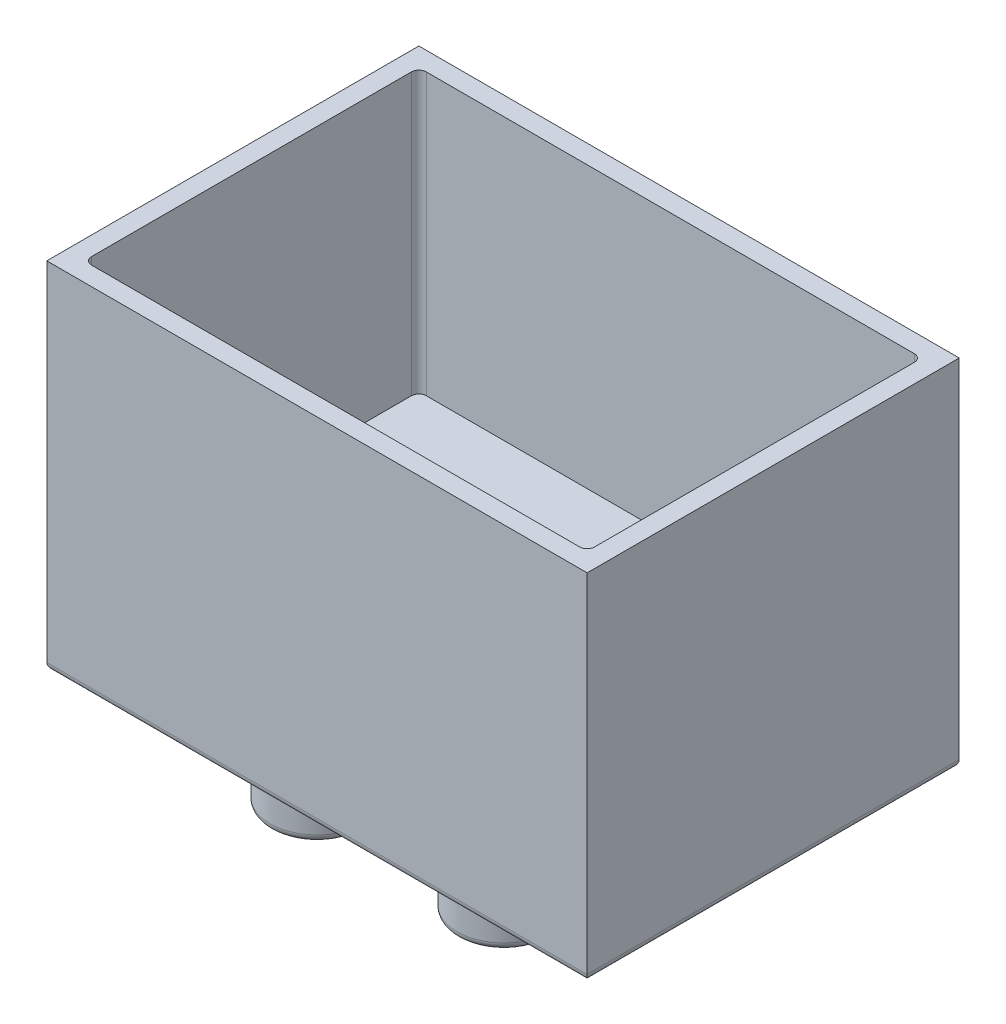
ISO-10303-21;
HEADER;
FILE_DESCRIPTION(('STEP AP214'),'2;1');
FILE_NAME('part.step','',(''),(''),'','','');
FILE_SCHEMA(('AUTOMOTIVE_DESIGN { 1 0 10303 214 1 1 1 1 }'));
ENDSEC;
DATA;
#1=APPLICATION_CONTEXT('core data for automotive mechanical design processes');
#2=APPLICATION_PROTOCOL_DEFINITION('international standard','automotive_design',2000,#1);
#3=PRODUCT_CONTEXT('',#1,'mechanical');
#4=PRODUCT('Part','Part','',(#3));
#5=PRODUCT_RELATED_PRODUCT_CATEGORY('part','',(#4));
#6=PRODUCT_DEFINITION_FORMATION('','',#4);
#7=PRODUCT_DEFINITION_CONTEXT('part definition',#1,'design');
#8=PRODUCT_DEFINITION('design','',#6,#7);
#9=PRODUCT_DEFINITION_SHAPE('','',#8);
#10=(LENGTH_UNIT() NAMED_UNIT(*) SI_UNIT(.MILLI.,.METRE.));
#11=(NAMED_UNIT(*) PLANE_ANGLE_UNIT() SI_UNIT($,.RADIAN.));
#12=(NAMED_UNIT(*) SI_UNIT($,.STERADIAN.) SOLID_ANGLE_UNIT());
#13=UNCERTAINTY_MEASURE_WITH_UNIT(LENGTH_MEASURE(1.E-05),#10,'distance_accuracy_value','');
#14=(GEOMETRIC_REPRESENTATION_CONTEXT(3) GLOBAL_UNCERTAINTY_ASSIGNED_CONTEXT((#13)) GLOBAL_UNIT_ASSIGNED_CONTEXT((#10,
#11,#12)) REPRESENTATION_CONTEXT('',''));
#15=CARTESIAN_POINT('',(0.,0.,0.));
#16=DIRECTION('',(0.,0.,1.));
#17=DIRECTION('',(1.,0.,0.));
#18=AXIS2_PLACEMENT_3D('',#15,#16,#17);
#19=CARTESIAN_POINT('',(0.,15.,0.2));
#20=DIRECTION('',(0.,0.,-1.));
#21=DIRECTION('',(-1.,0.,0.));
#22=AXIS2_PLACEMENT_3D('',#19,#20,#21);
#23=PLANE('',#22);
#24=DIRECTION('',(1.,0.,0.));
#25=VECTOR('',#24,1.);
#26=CARTESIAN_POINT('',(0.,15.,0.2));
#27=LINE('',#26,#25);
#28=CARTESIAN_POINT('',(0.2,15.,0.2));
#29=VERTEX_POINT('',#28);
#30=CARTESIAN_POINT('',(26.3,15.,0.2));
#31=VERTEX_POINT('',#30);
#32=EDGE_CURVE('E180',#29,#31,#27,.T.);
#33=ORIENTED_EDGE('',*,*,#32,.T.);
#34=DIRECTION('',(0.,-1.,0.));
#35=VECTOR('',#34,1.);
#36=CARTESIAN_POINT('',(26.3,0.,0.2));
#37=LINE('',#36,#35);
#38=CARTESIAN_POINT('',(26.3,0.,0.2));
#39=VERTEX_POINT('',#38);
#40=EDGE_CURVE('E255',#31,#39,#37,.T.);
#41=ORIENTED_EDGE('',*,*,#40,.T.);
#42=DIRECTION('',(1.,0.,0.));
#43=VECTOR('',#42,1.);
#44=CARTESIAN_POINT('',(0.,0.,0.2));
#45=LINE('',#44,#43);
#46=CARTESIAN_POINT('',(0.2,0.,0.2));
#47=VERTEX_POINT('',#46);
#48=EDGE_CURVE('E192',#47,#39,#45,.T.);
#49=ORIENTED_EDGE('',*,*,#48,.F.);
#50=DIRECTION('',(0.,-1.,0.));
#51=VECTOR('',#50,1.);
#52=CARTESIAN_POINT('',(0.2,15.,0.2));
#53=LINE('',#52,#51);
#54=EDGE_CURVE('E244',#47,#29,#53,.F.);
#55=ORIENTED_EDGE('',*,*,#54,.T.);
#56=EDGE_LOOP('',(#33,#41,#49,#55));
#57=FACE_BOUND('',#56,.T.);
#58=ADVANCED_FACE('F45',(#57),#23,.T.);
#59=CARTESIAN_POINT('',(-0.2,15.,0.));
#60=DIRECTION('',(-1.,0.,0.));
#61=DIRECTION('',(0.,0.,1.));
#62=AXIS2_PLACEMENT_3D('',#59,#60,#61);
#63=PLANE('',#62);
#64=DIRECTION('',(0.,0.,-1.));
#65=VECTOR('',#64,1.);
#66=CARTESIAN_POINT('',(-0.2,15.,0.));
#67=LINE('',#66,#65);
#68=CARTESIAN_POINT('',(-0.2,15.,-0.2));
#69=VERTEX_POINT('',#68);
#70=CARTESIAN_POINT('',(-0.2,15.,-17.3));
#71=VERTEX_POINT('',#70);
#72=EDGE_CURVE('E183',#69,#71,#67,.T.);
#73=ORIENTED_EDGE('',*,*,#72,.F.);
#74=DIRECTION('',(0.,-1.,0.));
#75=VECTOR('',#74,1.);
#76=CARTESIAN_POINT('',(-0.2,15.,-0.2));
#77=LINE('',#76,#75);
#78=CARTESIAN_POINT('',(-0.2,0.,-0.2));
#79=VERTEX_POINT('',#78);
#80=EDGE_CURVE('E277',#69,#79,#77,.T.);
#81=ORIENTED_EDGE('',*,*,#80,.T.);
#82=DIRECTION('',(0.,0.,-1.));
#83=VECTOR('',#82,1.);
#84=CARTESIAN_POINT('',(-0.2,0.,0.));
#85=LINE('',#84,#83);
#86=CARTESIAN_POINT('',(-0.2,0.,-17.3));
#87=VERTEX_POINT('',#86);
#88=EDGE_CURVE('E195',#79,#87,#85,.T.);
#89=ORIENTED_EDGE('',*,*,#88,.T.);
#90=DIRECTION('',(0.,-1.,0.));
#91=VECTOR('',#90,1.);
#92=CARTESIAN_POINT('',(-0.2,15.,-17.3));
#93=LINE('',#92,#91);
#94=EDGE_CURVE('E60',#87,#71,#93,.F.);
#95=ORIENTED_EDGE('',*,*,#94,.T.);
#96=EDGE_LOOP('',(#73,#81,#89,#95));
#97=FACE_BOUND('',#96,.T.);
#98=ADVANCED_FACE('F304',(#97),#63,.F.);
#99=CARTESIAN_POINT('',(0.,15.,-17.7));
#100=DIRECTION('',(0.,0.,-1.));
#101=DIRECTION('',(-1.,0.,0.));
#102=AXIS2_PLACEMENT_3D('',#99,#100,#101);
#103=PLANE('',#102);
#104=DIRECTION('',(1.,0.,0.));
#105=VECTOR('',#104,1.);
#106=CARTESIAN_POINT('',(0.,0.,-17.7));
#107=LINE('',#106,#105);
#108=CARTESIAN_POINT('',(0.2,0.,-17.7));
#109=VERTEX_POINT('',#108);
#110=CARTESIAN_POINT('',(26.3,0.,-17.7));
#111=VERTEX_POINT('',#110);
#112=EDGE_CURVE('E175',#109,#111,#107,.T.);
#113=ORIENTED_EDGE('',*,*,#112,.T.);
#114=DIRECTION('',(0.,-1.,0.));
#115=VECTOR('',#114,1.);
#116=CARTESIAN_POINT('',(26.3,15.,-17.7));
#117=LINE('',#116,#115);
#118=CARTESIAN_POINT('',(26.3,15.,-17.7));
#119=VERTEX_POINT('',#118);
#120=EDGE_CURVE('E274',#111,#119,#117,.F.);
#121=ORIENTED_EDGE('',*,*,#120,.T.);
#122=DIRECTION('',(1.,0.,0.));
#123=VECTOR('',#122,1.);
#124=CARTESIAN_POINT('',(0.,15.,-17.7));
#125=LINE('',#124,#123);
#126=CARTESIAN_POINT('',(0.2,15.,-17.7));
#127=VERTEX_POINT('',#126);
#128=EDGE_CURVE('E185',#127,#119,#125,.T.);
#129=ORIENTED_EDGE('',*,*,#128,.F.);
#130=DIRECTION('',(0.,-1.,0.));
#131=VECTOR('',#130,1.);
#132=CARTESIAN_POINT('',(0.2,0.,-17.7));
#133=LINE('',#132,#131);
#134=EDGE_CURVE('E271',#127,#109,#133,.T.);
#135=ORIENTED_EDGE('',*,*,#134,.T.);
#136=EDGE_LOOP('',(#113,#121,#129,#135));
#137=FACE_BOUND('',#136,.T.);
#138=ADVANCED_FACE('F299',(#137),#103,.F.);
#139=CARTESIAN_POINT('',(-1.2,15.,0.));
#140=DIRECTION('',(-1.,0.,0.));
#141=DIRECTION('',(0.,0.,1.));
#142=AXIS2_PLACEMENT_3D('',#139,#140,#141);
#143=PLANE('',#142);
#144=DIRECTION('',(0.,-1.,0.));
#145=VECTOR('',#144,1.);
#146=CARTESIAN_POINT('',(-1.2,15.,-18.7));
#147=LINE('',#146,#145);
#148=CARTESIAN_POINT('',(-1.2,15.,-18.7));
#149=VERTEX_POINT('',#148);
#150=CARTESIAN_POINT('',(-1.2,-3.6,-18.7));
#151=VERTEX_POINT('',#150);
#152=EDGE_CURVE('E191',#149,#151,#147,.T.);
#153=ORIENTED_EDGE('',*,*,#152,.T.);
#154=DIRECTION('',(0.,0.,-1.));
#155=VECTOR('',#154,1.);
#156=CARTESIAN_POINT('',(-1.2,-3.6,1.2));
#157=LINE('',#156,#155);
#158=CARTESIAN_POINT('',(-1.2,-3.6,1.2));
#159=VERTEX_POINT('',#158);
#160=EDGE_CURVE('E154',#151,#159,#157,.F.);
#161=ORIENTED_EDGE('',*,*,#160,.T.);
#162=DIRECTION('',(0.,-1.,0.));
#163=VECTOR('',#162,1.);
#164=CARTESIAN_POINT('',(-1.2,15.,1.2));
#165=LINE('',#164,#163);
#166=CARTESIAN_POINT('',(-1.2,15.,1.2));
#167=VERTEX_POINT('',#166);
#168=EDGE_CURVE('E146',#167,#159,#165,.T.);
#169=ORIENTED_EDGE('',*,*,#168,.F.);
#170=DIRECTION('',(0.,0.,-1.));
#171=VECTOR('',#170,1.);
#172=CARTESIAN_POINT('',(-1.2,15.,0.));
#173=LINE('',#172,#171);
#174=EDGE_CURVE('E151',#167,#149,#173,.T.);
#175=ORIENTED_EDGE('',*,*,#174,.T.);
#176=EDGE_LOOP('',(#153,#161,#169,#175));
#177=FACE_BOUND('',#176,.T.);
#178=ADVANCED_FACE('F149',(#177),#143,.T.);
#179=CARTESIAN_POINT('',(0.,15.,1.2));
#180=DIRECTION('',(0.,0.,-1.));
#181=DIRECTION('',(-1.,0.,0.));
#182=AXIS2_PLACEMENT_3D('',#179,#180,#181);
#183=PLANE('',#182);
#184=ORIENTED_EDGE('',*,*,#168,.T.);
#185=DIRECTION('',(1.,0.,0.));
#186=VECTOR('',#185,1.);
#187=CARTESIAN_POINT('',(0.,-3.6,1.2));
#188=LINE('',#187,#186);
#189=CARTESIAN_POINT('',(27.7,-3.6,1.2));
#190=VERTEX_POINT('',#189);
#191=EDGE_CURVE('E158',#159,#190,#188,.T.);
#192=ORIENTED_EDGE('',*,*,#191,.T.);
#193=DIRECTION('',(0.,-1.,0.));
#194=VECTOR('',#193,1.);
#195=CARTESIAN_POINT('',(27.7,15.,1.2));
#196=LINE('',#195,#194);
#197=CARTESIAN_POINT('',(27.7,15.,1.2));
#198=VERTEX_POINT('',#197);
#199=EDGE_CURVE('E159',#198,#190,#196,.T.);
#200=ORIENTED_EDGE('',*,*,#199,.F.);
#201=DIRECTION('',(1.,0.,0.));
#202=VECTOR('',#201,1.);
#203=CARTESIAN_POINT('',(0.,15.,1.2));
#204=LINE('',#203,#202);
#205=EDGE_CURVE('E162',#167,#198,#204,.T.);
#206=ORIENTED_EDGE('',*,*,#205,.F.);
#207=EDGE_LOOP('',(#184,#192,#200,#206));
#208=FACE_BOUND('',#207,.T.);
#209=ADVANCED_FACE('F163',(#208),#183,.F.);
#210=CARTESIAN_POINT('',(27.7,15.,0.));
#211=DIRECTION('',(-1.,0.,0.));
#212=DIRECTION('',(0.,0.,1.));
#213=AXIS2_PLACEMENT_3D('',#210,#211,#212);
#214=PLANE('',#213);
#215=ORIENTED_EDGE('',*,*,#199,.T.);
#216=DIRECTION('',(0.,0.,-1.));
#217=VECTOR('',#216,1.);
#218=CARTESIAN_POINT('',(27.7,-3.6,0.));
#219=LINE('',#218,#217);
#220=CARTESIAN_POINT('',(27.7,-3.6,-18.7));
#221=VERTEX_POINT('',#220);
#222=EDGE_CURVE('E221',#190,#221,#219,.T.);
#223=ORIENTED_EDGE('',*,*,#222,.T.);
#224=DIRECTION('',(0.,-1.,0.));
#225=VECTOR('',#224,1.);
#226=CARTESIAN_POINT('',(27.7,15.,-18.7));
#227=LINE('',#226,#225);
#228=CARTESIAN_POINT('',(27.7,15.,-18.7));
#229=VERTEX_POINT('',#228);
#230=EDGE_CURVE('E201',#229,#221,#227,.T.);
#231=ORIENTED_EDGE('',*,*,#230,.F.);
#232=DIRECTION('',(0.,0.,-1.));
#233=VECTOR('',#232,1.);
#234=CARTESIAN_POINT('',(27.7,15.,0.));
#235=LINE('',#234,#233);
#236=EDGE_CURVE('E167',#198,#229,#235,.T.);
#237=ORIENTED_EDGE('',*,*,#236,.F.);
#238=EDGE_LOOP('',(#215,#223,#231,#237));
#239=FACE_BOUND('',#238,.T.);
#240=ADVANCED_FACE('F337',(#239),#214,.F.);
#241=CARTESIAN_POINT('',(0.,15.,-18.7));
#242=DIRECTION('',(0.,0.,-1.));
#243=DIRECTION('',(-1.,0.,0.));
#244=AXIS2_PLACEMENT_3D('',#241,#242,#243);
#245=PLANE('',#244);
#246=ORIENTED_EDGE('',*,*,#230,.T.);
#247=DIRECTION('',(1.,0.,0.));
#248=VECTOR('',#247,1.);
#249=CARTESIAN_POINT('',(-1.2,-3.6,-18.7));
#250=LINE('',#249,#248);
#251=EDGE_CURVE('E223',#221,#151,#250,.F.);
#252=ORIENTED_EDGE('',*,*,#251,.T.);
#253=ORIENTED_EDGE('',*,*,#152,.F.);
#254=DIRECTION('',(1.,0.,0.));
#255=VECTOR('',#254,1.);
#256=CARTESIAN_POINT('',(0.,15.,-18.7));
#257=LINE('',#256,#255);
#258=EDGE_CURVE('E171',#149,#229,#257,.T.);
#259=ORIENTED_EDGE('',*,*,#258,.T.);
#260=EDGE_LOOP('',(#246,#252,#253,#259));
#261=FACE_BOUND('',#260,.T.);
#262=ADVANCED_FACE('F334',(#261),#245,.T.);
#263=CARTESIAN_POINT('',(26.7,15.,0.));
#264=DIRECTION('',(-1.,0.,0.));
#265=DIRECTION('',(0.,0.,1.));
#266=AXIS2_PLACEMENT_3D('',#263,#264,#265);
#267=PLANE('',#266);
#268=DIRECTION('',(0.,0.,-1.));
#269=VECTOR('',#268,1.);
#270=CARTESIAN_POINT('',(26.7,0.,0.));
#271=LINE('',#270,#269);
#272=CARTESIAN_POINT('',(26.7,0.,-0.2));
#273=VERTEX_POINT('',#272);
#274=CARTESIAN_POINT('',(26.7,0.,-17.3));
#275=VERTEX_POINT('',#274);
#276=EDGE_CURVE('E172',#273,#275,#271,.T.);
#277=ORIENTED_EDGE('',*,*,#276,.F.);
#278=DIRECTION('',(0.,-1.,0.));
#279=VECTOR('',#278,1.);
#280=CARTESIAN_POINT('',(26.7,15.,-0.2));
#281=LINE('',#280,#279);
#282=CARTESIAN_POINT('',(26.7,15.,-0.2));
#283=VERTEX_POINT('',#282);
#284=EDGE_CURVE('E269',#273,#283,#281,.F.);
#285=ORIENTED_EDGE('',*,*,#284,.T.);
#286=DIRECTION('',(0.,0.,-1.));
#287=VECTOR('',#286,1.);
#288=CARTESIAN_POINT('',(26.7,15.,0.));
#289=LINE('',#288,#287);
#290=CARTESIAN_POINT('',(26.7,15.,-17.3));
#291=VERTEX_POINT('',#290);
#292=EDGE_CURVE('E188',#283,#291,#289,.T.);
#293=ORIENTED_EDGE('',*,*,#292,.T.);
#294=DIRECTION('',(0.,-1.,0.));
#295=VECTOR('',#294,1.);
#296=CARTESIAN_POINT('',(26.7,15.,-17.3));
#297=LINE('',#296,#295);
#298=EDGE_CURVE('E266',#291,#275,#297,.T.);
#299=ORIENTED_EDGE('',*,*,#298,.T.);
#300=EDGE_LOOP('',(#277,#285,#293,#299));
#301=FACE_BOUND('',#300,.T.);
#302=ADVANCED_FACE('F292',(#301),#267,.T.);
#303=CARTESIAN_POINT('',(0.,15.,0.));
#304=DIRECTION('',(0.,1.,0.));
#305=DIRECTION('',(0.,0.,1.));
#306=AXIS2_PLACEMENT_3D('',#303,#304,#305);
#307=PLANE('',#306);
#308=ORIENTED_EDGE('',*,*,#174,.F.);
#309=ORIENTED_EDGE('',*,*,#205,.T.);
#310=ORIENTED_EDGE('',*,*,#236,.T.);
#311=ORIENTED_EDGE('',*,*,#258,.F.);
#312=EDGE_LOOP('',(#308,#309,#310,#311));
#313=FACE_BOUND('',#312,.T.);
#314=ORIENTED_EDGE('',*,*,#32,.F.);
#315=CARTESIAN_POINT('',(0.2,15.,-0.2));
#316=DIRECTION('',(0.,1.,0.));
#317=DIRECTION('',(0.,0.,1.));
#318=AXIS2_PLACEMENT_3D('',#315,#316,#317);
#319=CIRCLE('',#318,0.4);
#320=EDGE_CURVE('E53',#29,#69,#319,.F.);
#321=ORIENTED_EDGE('',*,*,#320,.T.);
#322=ORIENTED_EDGE('',*,*,#72,.T.);
#323=CARTESIAN_POINT('',(0.2,15.,-17.3));
#324=DIRECTION('',(0.,1.,0.));
#325=DIRECTION('',(0.,0.,1.));
#326=AXIS2_PLACEMENT_3D('',#323,#324,#325);
#327=CIRCLE('',#326,0.4);
#328=EDGE_CURVE('E11',#71,#127,#327,.F.);
#329=ORIENTED_EDGE('',*,*,#328,.T.);
#330=ORIENTED_EDGE('',*,*,#128,.T.);
#331=CARTESIAN_POINT('',(26.3,15.,-17.3));
#332=DIRECTION('',(0.,1.,0.));
#333=DIRECTION('',(0.,0.,1.));
#334=AXIS2_PLACEMENT_3D('',#331,#332,#333);
#335=CIRCLE('',#334,0.4);
#336=EDGE_CURVE('E282',#119,#291,#335,.F.);
#337=ORIENTED_EDGE('',*,*,#336,.T.);
#338=ORIENTED_EDGE('',*,*,#292,.F.);
#339=CARTESIAN_POINT('',(26.3,15.,-0.2));
#340=DIRECTION('',(0.,1.,0.));
#341=DIRECTION('',(0.,0.,1.));
#342=AXIS2_PLACEMENT_3D('',#339,#340,#341);
#343=CIRCLE('',#342,0.4);
#344=EDGE_CURVE('E280',#283,#31,#343,.F.);
#345=ORIENTED_EDGE('',*,*,#344,.T.);
#346=EDGE_LOOP('',(#314,#321,#322,#329,#330,#337,#338,#345));
#347=FACE_BOUND('',#346,.T.);
#348=ADVANCED_FACE('F169',(#313,#347),#307,.T.);
#349=CARTESIAN_POINT('',(0.,0.,0.));
#350=DIRECTION('',(0.,1.,0.));
#351=DIRECTION('',(0.,0.,1.));
#352=AXIS2_PLACEMENT_3D('',#349,#350,#351);
#353=PLANE('',#352);
#354=ORIENTED_EDGE('',*,*,#48,.T.);
#355=CARTESIAN_POINT('',(26.3,0.,-0.2));
#356=DIRECTION('',(0.,1.,0.));
#357=DIRECTION('',(0.,0.,1.));
#358=AXIS2_PLACEMENT_3D('',#355,#356,#357);
#359=CIRCLE('',#358,0.4);
#360=EDGE_CURVE('E264',#39,#273,#359,.T.);
#361=ORIENTED_EDGE('',*,*,#360,.T.);
#362=ORIENTED_EDGE('',*,*,#276,.T.);
#363=CARTESIAN_POINT('',(26.3,0.,-17.3));
#364=DIRECTION('',(0.,1.,0.));
#365=DIRECTION('',(0.,0.,1.));
#366=AXIS2_PLACEMENT_3D('',#363,#364,#365);
#367=CIRCLE('',#366,0.4);
#368=EDGE_CURVE('E262',#275,#111,#367,.T.);
#369=ORIENTED_EDGE('',*,*,#368,.T.);
#370=ORIENTED_EDGE('',*,*,#112,.F.);
#371=CARTESIAN_POINT('',(0.2,0.,-17.3));
#372=DIRECTION('',(0.,1.,0.));
#373=DIRECTION('',(0.,0.,1.));
#374=AXIS2_PLACEMENT_3D('',#371,#372,#373);
#375=CIRCLE('',#374,0.4);
#376=EDGE_CURVE('E258',#109,#87,#375,.T.);
#377=ORIENTED_EDGE('',*,*,#376,.T.);
#378=ORIENTED_EDGE('',*,*,#88,.F.);
#379=CARTESIAN_POINT('',(0.2,0.,-0.2));
#380=DIRECTION('',(0.,1.,0.));
#381=DIRECTION('',(0.,0.,1.));
#382=AXIS2_PLACEMENT_3D('',#379,#380,#381);
#383=CIRCLE('',#382,0.4);
#384=EDGE_CURVE('E260',#79,#47,#383,.T.);
#385=ORIENTED_EDGE('',*,*,#384,.T.);
#386=EDGE_LOOP('',(#354,#361,#362,#369,#370,#377,#378,#385));
#387=FACE_BOUND('',#386,.T.);
#388=ADVANCED_FACE('F297',(#387),#353,.T.);
#389=CARTESIAN_POINT('',(0.,-4.,0.));
#390=DIRECTION('',(0.,1.,0.));
#391=DIRECTION('',(0.,0.,1.));
#392=AXIS2_PLACEMENT_3D('',#389,#390,#391);
#393=PLANE('',#392);
#394=DIRECTION('',(0.,0.,-1.));
#395=VECTOR('',#394,1.);
#396=CARTESIAN_POINT('',(27.3,-4.,0.));
#397=LINE('',#396,#395);
#398=CARTESIAN_POINT('',(27.3,-4.,-18.3));
#399=VERTEX_POINT('',#398);
#400=CARTESIAN_POINT('',(27.3,-4.,0.8));
#401=VERTEX_POINT('',#400);
#402=EDGE_CURVE('E216',#399,#401,#397,.F.);
#403=ORIENTED_EDGE('',*,*,#402,.T.);
#404=DIRECTION('',(1.,0.,0.));
#405=VECTOR('',#404,1.);
#406=CARTESIAN_POINT('',(0.,-4.,0.8));
#407=LINE('',#406,#405);
#408=CARTESIAN_POINT('',(-0.8,-4.,0.8));
#409=VERTEX_POINT('',#408);
#410=EDGE_CURVE('E218',#401,#409,#407,.F.);
#411=ORIENTED_EDGE('',*,*,#410,.T.);
#412=DIRECTION('',(0.,0.,-1.));
#413=VECTOR('',#412,1.);
#414=CARTESIAN_POINT('',(-0.8,-4.,-18.7));
#415=LINE('',#414,#413);
#416=CARTESIAN_POINT('',(-0.8,-4.,-18.3));
#417=VERTEX_POINT('',#416);
#418=EDGE_CURVE('E212',#409,#417,#415,.T.);
#419=ORIENTED_EDGE('',*,*,#418,.T.);
#420=DIRECTION('',(1.,0.,0.));
#421=VECTOR('',#420,1.);
#422=CARTESIAN_POINT('',(27.7,-4.,-18.3));
#423=LINE('',#422,#421);
#424=EDGE_CURVE('E214',#417,#399,#423,.T.);
#425=ORIENTED_EDGE('',*,*,#424,.T.);
#426=EDGE_LOOP('',(#403,#411,#419,#425));
#427=FACE_BOUND('',#426,.T.);
#428=CARTESIAN_POINT('',(8.25,-4.,-3.8));
#429=DIRECTION('',(0.,1.,0.));
#430=DIRECTION('',(0.,0.,1.));
#431=AXIS2_PLACEMENT_3D('',#428,#429,#430);
#432=CIRCLE('',#431,2.9);
#433=CARTESIAN_POINT('',(8.25,-4.,-0.9));
#434=VERTEX_POINT('',#433);
#435=EDGE_CURVE('E209',#434,#434,#432,.T.);
#436=ORIENTED_EDGE('',*,*,#435,.T.);
#437=EDGE_LOOP('',(#436));
#438=FACE_BOUND('',#437,.T.);
#439=CARTESIAN_POINT('',(18.25,-4.,-3.8));
#440=DIRECTION('',(0.,1.,0.));
#441=DIRECTION('',(0.,0.,1.));
#442=AXIS2_PLACEMENT_3D('',#439,#440,#441);
#443=CIRCLE('',#442,2.9);
#444=CARTESIAN_POINT('',(18.25,-4.,-0.900000000000001));
#445=VERTEX_POINT('',#444);
#446=EDGE_CURVE('E206',#445,#445,#443,.T.);
#447=ORIENTED_EDGE('',*,*,#446,.T.);
#448=EDGE_LOOP('',(#447));
#449=FACE_BOUND('',#448,.T.);
#450=ADVANCED_FACE('F395',(#427,#438,#449),#393,.F.);
#451=CARTESIAN_POINT('',(8.25,-8.,-3.8));
#452=DIRECTION('',(0.,1.,0.));
#453=DIRECTION('',(0.,0.,1.));
#454=AXIS2_PLACEMENT_3D('',#451,#452,#453);
#455=CYLINDRICAL_SURFACE('',#454,2.5);
#456=CARTESIAN_POINT('',(8.25,-4.4,-3.8));
#457=DIRECTION('',(0.,1.,0.));
#458=DIRECTION('',(0.,0.,1.));
#459=AXIS2_PLACEMENT_3D('',#456,#457,#458);
#460=CIRCLE('',#459,2.5);
#461=CARTESIAN_POINT('',(8.25,-4.4,-1.3));
#462=VERTEX_POINT('',#461);
#463=EDGE_CURVE('E229',#462,#462,#460,.F.);
#464=ORIENTED_EDGE('',*,*,#463,.T.);
#465=EDGE_LOOP('',(#464));
#466=FACE_BOUND('',#465,.T.);
#467=CARTESIAN_POINT('',(8.25,-7.6,-3.8));
#468=DIRECTION('',(0.,-1.,0.));
#469=DIRECTION('',(0.,0.,-1.));
#470=AXIS2_PLACEMENT_3D('',#467,#468,#469);
#471=CIRCLE('',#470,2.5);
#472=CARTESIAN_POINT('',(8.25,-7.6,-6.3));
#473=VERTEX_POINT('',#472);
#474=EDGE_CURVE('E226',#473,#473,#471,.F.);
#475=ORIENTED_EDGE('',*,*,#474,.T.);
#476=EDGE_LOOP('',(#475));
#477=FACE_BOUND('',#476,.T.);
#478=ADVANCED_FACE('F391',(#466,#477),#455,.T.);
#479=CARTESIAN_POINT('',(8.25,-8.,-3.8));
#480=DIRECTION('',(0.,-1.,0.));
#481=DIRECTION('',(0.,0.,-1.));
#482=AXIS2_PLACEMENT_3D('',#479,#480,#481);
#483=PLANE('',#482);
#484=CARTESIAN_POINT('',(8.25,-8.,-3.8));
#485=DIRECTION('',(0.,-1.,0.));
#486=DIRECTION('',(0.,0.,-1.));
#487=AXIS2_PLACEMENT_3D('',#484,#485,#486);
#488=CIRCLE('',#487,2.1);
#489=CARTESIAN_POINT('',(8.25,-8.,-5.9));
#490=VERTEX_POINT('',#489);
#491=EDGE_CURVE('E241',#490,#490,#488,.T.);
#492=ORIENTED_EDGE('',*,*,#491,.T.);
#493=EDGE_LOOP('',(#492));
#494=FACE_BOUND('',#493,.T.);
#495=ADVANCED_FACE('F385',(#494),#483,.T.);
#496=CARTESIAN_POINT('',(18.25,-8.,-3.8));
#497=DIRECTION('',(0.,1.,0.));
#498=DIRECTION('',(0.,0.,1.));
#499=AXIS2_PLACEMENT_3D('',#496,#497,#498);
#500=CYLINDRICAL_SURFACE('',#499,2.5);
#501=CARTESIAN_POINT('',(18.25,-4.4,-3.8));
#502=DIRECTION('',(0.,1.,0.));
#503=DIRECTION('',(0.,0.,1.));
#504=AXIS2_PLACEMENT_3D('',#501,#502,#503);
#505=CIRCLE('',#504,2.5);
#506=CARTESIAN_POINT('',(18.25,-4.4,-1.3));
#507=VERTEX_POINT('',#506);
#508=EDGE_CURVE('E235',#507,#507,#505,.F.);
#509=ORIENTED_EDGE('',*,*,#508,.T.);
#510=EDGE_LOOP('',(#509));
#511=FACE_BOUND('',#510,.T.);
#512=CARTESIAN_POINT('',(18.25,-7.6,-3.8));
#513=DIRECTION('',(0.,1.,0.));
#514=DIRECTION('',(0.,0.,1.));
#515=AXIS2_PLACEMENT_3D('',#512,#513,#514);
#516=CIRCLE('',#515,2.5);
#517=CARTESIAN_POINT('',(18.25,-7.6,-1.3));
#518=VERTEX_POINT('',#517);
#519=EDGE_CURVE('E232',#518,#518,#516,.T.);
#520=ORIENTED_EDGE('',*,*,#519,.T.);
#521=EDGE_LOOP('',(#520));
#522=FACE_BOUND('',#521,.T.);
#523=ADVANCED_FACE('F380',(#511,#522),#500,.T.);
#524=CARTESIAN_POINT('',(18.25,-8.,-3.8));
#525=DIRECTION('',(0.,1.,0.));
#526=DIRECTION('',(0.,0.,1.));
#527=AXIS2_PLACEMENT_3D('',#524,#525,#526);
#528=PLANE('',#527);
#529=CARTESIAN_POINT('',(18.25,-8.,-3.8));
#530=DIRECTION('',(0.,1.,0.));
#531=DIRECTION('',(0.,0.,1.));
#532=AXIS2_PLACEMENT_3D('',#529,#530,#531);
#533=CIRCLE('',#532,2.1);
#534=CARTESIAN_POINT('',(18.25,-8.,-1.7));
#535=VERTEX_POINT('',#534);
#536=EDGE_CURVE('E238',#535,#535,#533,.F.);
#537=ORIENTED_EDGE('',*,*,#536,.T.);
#538=EDGE_LOOP('',(#537));
#539=FACE_BOUND('',#538,.T.);
#540=ADVANCED_FACE('F362',(#539),#528,.F.);
#541=CARTESIAN_POINT('',(0.,-3.6,-18.3));
#542=DIRECTION('',(-1.,0.,0.));
#543=DIRECTION('',(0.,0.,1.));
#544=AXIS2_PLACEMENT_3D('',#541,#542,#543);
#545=CYLINDRICAL_SURFACE('',#544,0.4);
#546=CARTESIAN_POINT('',(27.3,-3.6,-18.3));
#547=DIRECTION('',(-0.707106781186547,0.,-0.707106781186547));
#548=DIRECTION('',(-0.707106781186547,0.,0.707106781186547));
#549=AXIS2_PLACEMENT_3D('',#546,#547,#548);
#550=ELLIPSE('',#549,0.565685424949238,0.4);
#551=EDGE_CURVE('E249',#399,#221,#550,.F.);
#552=ORIENTED_EDGE('',*,*,#551,.F.);
#553=ORIENTED_EDGE('',*,*,#424,.F.);
#554=CARTESIAN_POINT('',(-0.8,-3.6,-18.3));
#555=DIRECTION('',(-0.707106781186547,0.,0.707106781186547));
#556=DIRECTION('',(0.707106781186547,0.,0.707106781186547));
#557=AXIS2_PLACEMENT_3D('',#554,#555,#556);
#558=ELLIPSE('',#557,0.565685424949238,0.4);
#559=EDGE_CURVE('E196',#151,#417,#558,.T.);
#560=ORIENTED_EDGE('',*,*,#559,.F.);
#561=ORIENTED_EDGE('',*,*,#251,.F.);
#562=EDGE_LOOP('',(#552,#553,#560,#561));
#563=FACE_BOUND('',#562,.T.);
#564=ADVANCED_FACE('F358',(#563),#545,.T.);
#565=CARTESIAN_POINT('',(-0.8,-3.6,0.));
#566=DIRECTION('',(0.,0.,1.));
#567=DIRECTION('',(1.,0.,0.));
#568=AXIS2_PLACEMENT_3D('',#565,#566,#567);
#569=CYLINDRICAL_SURFACE('',#568,0.4);
#570=ORIENTED_EDGE('',*,*,#559,.T.);
#571=ORIENTED_EDGE('',*,*,#418,.F.);
#572=CARTESIAN_POINT('',(-0.8,-3.6,0.8));
#573=DIRECTION('',(0.707106781186547,0.,0.707106781186547));
#574=DIRECTION('',(-0.707106781186547,0.,0.707106781186547));
#575=AXIS2_PLACEMENT_3D('',#572,#573,#574);
#576=ELLIPSE('',#575,0.565685424949238,0.4);
#577=EDGE_CURVE('E247',#159,#409,#576,.T.);
#578=ORIENTED_EDGE('',*,*,#577,.F.);
#579=ORIENTED_EDGE('',*,*,#160,.F.);
#580=EDGE_LOOP('',(#570,#571,#578,#579));
#581=FACE_BOUND('',#580,.T.);
#582=ADVANCED_FACE('F354',(#581),#569,.T.);
#583=CARTESIAN_POINT('',(27.3,-3.6,0.));
#584=DIRECTION('',(0.,0.,-1.));
#585=DIRECTION('',(-1.,0.,0.));
#586=AXIS2_PLACEMENT_3D('',#583,#584,#585);
#587=CYLINDRICAL_SURFACE('',#586,0.4);
#588=ORIENTED_EDGE('',*,*,#551,.T.);
#589=ORIENTED_EDGE('',*,*,#222,.F.);
#590=CARTESIAN_POINT('',(27.3,-3.6,0.8));
#591=DIRECTION('',(0.707106781186547,0.,-0.707106781186547));
#592=DIRECTION('',(-0.707106781186547,0.,-0.707106781186547));
#593=AXIS2_PLACEMENT_3D('',#590,#591,#592);
#594=ELLIPSE('',#593,0.565685424949238,0.4);
#595=EDGE_CURVE('E245',#401,#190,#594,.F.);
#596=ORIENTED_EDGE('',*,*,#595,.F.);
#597=ORIENTED_EDGE('',*,*,#402,.F.);
#598=EDGE_LOOP('',(#588,#589,#596,#597));
#599=FACE_BOUND('',#598,.T.);
#600=ADVANCED_FACE('F350',(#599),#587,.T.);
#601=CARTESIAN_POINT('',(0.,-3.6,0.8));
#602=DIRECTION('',(1.,0.,0.));
#603=DIRECTION('',(0.,0.,-1.));
#604=AXIS2_PLACEMENT_3D('',#601,#602,#603);
#605=CYLINDRICAL_SURFACE('',#604,0.4);
#606=ORIENTED_EDGE('',*,*,#577,.T.);
#607=ORIENTED_EDGE('',*,*,#410,.F.);
#608=ORIENTED_EDGE('',*,*,#595,.T.);
#609=ORIENTED_EDGE('',*,*,#191,.F.);
#610=EDGE_LOOP('',(#606,#607,#608,#609));
#611=FACE_BOUND('',#610,.T.);
#612=ADVANCED_FACE('F346',(#611),#605,.T.);
#613=CARTESIAN_POINT('',(8.25,-4.4,-3.8));
#614=DIRECTION('',(0.,1.,0.));
#615=DIRECTION('',(0.,0.,1.));
#616=AXIS2_PLACEMENT_3D('',#613,#614,#615);
#617=TOROIDAL_SURFACE('',#616,2.9,0.4);
#618=ORIENTED_EDGE('',*,*,#435,.F.);
#619=EDGE_LOOP('',(#618));
#620=FACE_BOUND('',#619,.T.);
#621=ORIENTED_EDGE('',*,*,#463,.F.);
#622=EDGE_LOOP('',(#621));
#623=FACE_BOUND('',#622,.T.);
#624=ADVANCED_FACE('F349',(#620,#623),#617,.F.);
#625=CARTESIAN_POINT('',(18.25,-4.4,-3.8));
#626=DIRECTION('',(0.,1.,0.));
#627=DIRECTION('',(0.,0.,1.));
#628=AXIS2_PLACEMENT_3D('',#625,#626,#627);
#629=TOROIDAL_SURFACE('',#628,2.9,0.4);
#630=ORIENTED_EDGE('',*,*,#446,.F.);
#631=EDGE_LOOP('',(#630));
#632=FACE_BOUND('',#631,.T.);
#633=ORIENTED_EDGE('',*,*,#508,.F.);
#634=EDGE_LOOP('',(#633));
#635=FACE_BOUND('',#634,.T.);
#636=ADVANCED_FACE('F366',(#632,#635),#629,.F.);
#637=CARTESIAN_POINT('',(18.25,-7.6,-3.8));
#638=DIRECTION('',(0.,1.,0.));
#639=DIRECTION('',(0.,0.,1.));
#640=AXIS2_PLACEMENT_3D('',#637,#638,#639);
#641=TOROIDAL_SURFACE('',#640,2.1,0.4);
#642=ORIENTED_EDGE('',*,*,#519,.F.);
#643=EDGE_LOOP('',(#642));
#644=FACE_BOUND('',#643,.T.);
#645=ORIENTED_EDGE('',*,*,#536,.F.);
#646=EDGE_LOOP('',(#645));
#647=FACE_BOUND('',#646,.T.);
#648=ADVANCED_FACE('F323',(#644,#647),#641,.T.);
#649=CARTESIAN_POINT('',(8.25,-7.6,-3.8));
#650=DIRECTION('',(0.,-1.,0.));
#651=DIRECTION('',(0.,0.,-1.));
#652=AXIS2_PLACEMENT_3D('',#649,#650,#651);
#653=TOROIDAL_SURFACE('',#652,2.1,0.4);
#654=ORIENTED_EDGE('',*,*,#474,.F.);
#655=EDGE_LOOP('',(#654));
#656=FACE_BOUND('',#655,.T.);
#657=ORIENTED_EDGE('',*,*,#491,.F.);
#658=EDGE_LOOP('',(#657));
#659=FACE_BOUND('',#658,.T.);
#660=ADVANCED_FACE('F315',(#656,#659),#653,.T.);
#661=CARTESIAN_POINT('',(26.3,15.,-0.2));
#662=DIRECTION('',(0.,1.,0.));
#663=DIRECTION('',(0.,0.,1.));
#664=AXIS2_PLACEMENT_3D('',#661,#662,#663);
#665=CYLINDRICAL_SURFACE('',#664,0.4);
#666=ORIENTED_EDGE('',*,*,#344,.F.);
#667=ORIENTED_EDGE('',*,*,#284,.F.);
#668=ORIENTED_EDGE('',*,*,#360,.F.);
#669=ORIENTED_EDGE('',*,*,#40,.F.);
#670=EDGE_LOOP('',(#666,#667,#668,#669));
#671=FACE_BOUND('',#670,.T.);
#672=ADVANCED_FACE('F313',(#671),#665,.F.);
#673=CARTESIAN_POINT('',(26.3,15.,-17.3));
#674=DIRECTION('',(0.,-1.,0.));
#675=DIRECTION('',(0.,0.,-1.));
#676=AXIS2_PLACEMENT_3D('',#673,#674,#675);
#677=CYLINDRICAL_SURFACE('',#676,0.4);
#678=ORIENTED_EDGE('',*,*,#336,.F.);
#679=ORIENTED_EDGE('',*,*,#120,.F.);
#680=ORIENTED_EDGE('',*,*,#368,.F.);
#681=ORIENTED_EDGE('',*,*,#298,.F.);
#682=EDGE_LOOP('',(#678,#679,#680,#681));
#683=FACE_BOUND('',#682,.T.);
#684=ADVANCED_FACE('F294',(#683),#677,.F.);
#685=CARTESIAN_POINT('',(0.2,15.,-0.2));
#686=DIRECTION('',(0.,-1.,0.));
#687=DIRECTION('',(0.,0.,-1.));
#688=AXIS2_PLACEMENT_3D('',#685,#686,#687);
#689=CYLINDRICAL_SURFACE('',#688,0.4);
#690=ORIENTED_EDGE('',*,*,#320,.F.);
#691=ORIENTED_EDGE('',*,*,#54,.F.);
#692=ORIENTED_EDGE('',*,*,#384,.F.);
#693=ORIENTED_EDGE('',*,*,#80,.F.);
#694=EDGE_LOOP('',(#690,#691,#692,#693));
#695=FACE_BOUND('',#694,.T.);
#696=ADVANCED_FACE('F307',(#695),#689,.F.);
#697=CARTESIAN_POINT('',(0.2,15.,-17.3));
#698=DIRECTION('',(0.,1.,0.));
#699=DIRECTION('',(0.,0.,1.));
#700=AXIS2_PLACEMENT_3D('',#697,#698,#699);
#701=CYLINDRICAL_SURFACE('',#700,0.4);
#702=ORIENTED_EDGE('',*,*,#328,.F.);
#703=ORIENTED_EDGE('',*,*,#94,.F.);
#704=ORIENTED_EDGE('',*,*,#376,.F.);
#705=ORIENTED_EDGE('',*,*,#134,.F.);
#706=EDGE_LOOP('',(#702,#703,#704,#705));
#707=FACE_BOUND('',#706,.T.);
#708=ADVANCED_FACE('F47',(#707),#701,.F.);
#709=CLOSED_SHELL('',(#58,#98,#138,#178,#209,#240,#262,#302,#348,#388,#450,#478,#495,#523,#540,
#564,#582,#600,#612,#624,#636,#648,#660,#672,#684,#696,#708));
#710=MANIFOLD_SOLID_BREP('B2',#709);
#711=ADVANCED_BREP_SHAPE_REPRESENTATION('',(#18,#710),#14);
#712=SHAPE_DEFINITION_REPRESENTATION(#9,#711);
ENDSEC;
END-ISO-10303-21;
